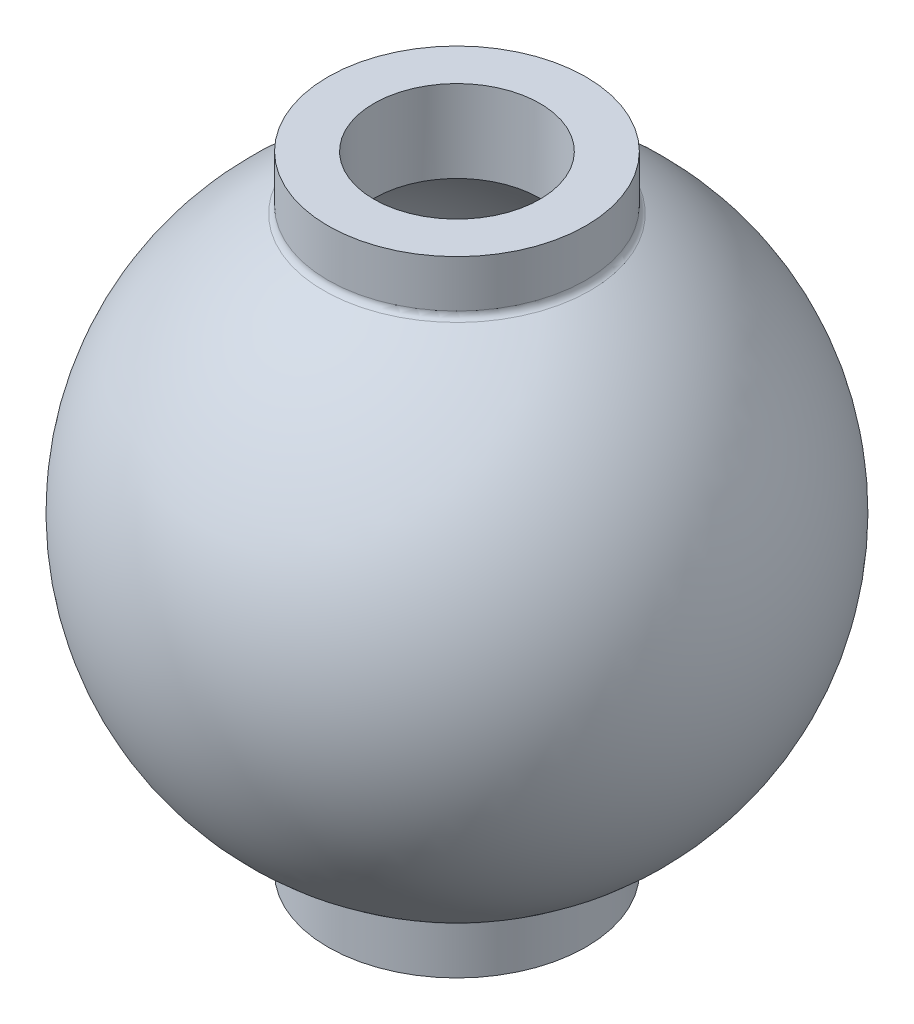
ISO-10303-21;
HEADER;
FILE_DESCRIPTION(('STEP AP214'),'2;1');
FILE_NAME('part.step','',(''),(''),'','','');
FILE_SCHEMA(('AUTOMOTIVE_DESIGN { 1 0 10303 214 1 1 1 1 }'));
ENDSEC;
DATA;
#1=APPLICATION_CONTEXT('core data for automotive mechanical design processes');
#2=APPLICATION_PROTOCOL_DEFINITION('international standard','automotive_design',2000,#1);
#3=PRODUCT_CONTEXT('',#1,'mechanical');
#4=PRODUCT('Part','Part','',(#3));
#5=PRODUCT_RELATED_PRODUCT_CATEGORY('part','',(#4));
#6=PRODUCT_DEFINITION_FORMATION('','',#4);
#7=PRODUCT_DEFINITION_CONTEXT('part definition',#1,'design');
#8=PRODUCT_DEFINITION('design','',#6,#7);
#9=PRODUCT_DEFINITION_SHAPE('','',#8);
#10=(LENGTH_UNIT() NAMED_UNIT(*) SI_UNIT(.MILLI.,.METRE.));
#11=(NAMED_UNIT(*) PLANE_ANGLE_UNIT() SI_UNIT($,.RADIAN.));
#12=(NAMED_UNIT(*) SI_UNIT($,.STERADIAN.) SOLID_ANGLE_UNIT());
#13=UNCERTAINTY_MEASURE_WITH_UNIT(LENGTH_MEASURE(1.E-05),#10,'distance_accuracy_value','');
#14=(GEOMETRIC_REPRESENTATION_CONTEXT(3) GLOBAL_UNCERTAINTY_ASSIGNED_CONTEXT((#13)) GLOBAL_UNIT_ASSIGNED_CONTEXT((#10,
#11,#12)) REPRESENTATION_CONTEXT('',''));
#15=CARTESIAN_POINT('',(0.,0.,0.));
#16=DIRECTION('',(0.,0.,1.));
#17=DIRECTION('',(1.,0.,0.));
#18=AXIS2_PLACEMENT_3D('',#15,#16,#17);
#19=CARTESIAN_POINT('',(0.,0.,0.));
#20=DIRECTION('',(0.,1.,0.));
#21=DIRECTION('',(-1.,0.,0.));
#22=AXIS2_PLACEMENT_3D('',#19,#20,#21);
#23=SPHERICAL_SURFACE('',#22,1120.);
#24=CARTESIAN_POINT('',(0.,-1079.0736768173,0.));
#25=DIRECTION('',(0.,1.,0.));
#26=DIRECTION('',(0.,0.,1.));
#27=AXIS2_PLACEMENT_3D('',#24,#25,#26);
#28=CIRCLE('',#27,300.);
#29=CARTESIAN_POINT('',(-300.,-1079.0736768173,0.));
#30=VERTEX_POINT('',#29);
#31=EDGE_CURVE('E43',#30,#30,#28,.T.);
#32=CARTESIAN_POINT('',(0.,-1073.3126291999,0.));
#33=DIRECTION('',(0.,1.,0.));
#34=DIRECTION('',(0.,0.,1.));
#35=AXIS2_PLACEMENT_3D('',#32,#33,#34);
#36=CIRCLE('',#35,320.);
#37=CARTESIAN_POINT('',(-320.,-1073.3126291999,0.));
#38=VERTEX_POINT('',#37);
#39=EDGE_CURVE('E59',#38,#38,#36,.T.);
#40=CARTESIAN_POINT('',(-300.,-1079.0736768173,0.));
#41=CARTESIAN_POINT('',(-300.208884943799,-1079.01560341186,0.));
#42=CARTESIAN_POINT('',(-300.417753024992,-1078.95746935311,0.));
#43=CARTESIAN_POINT('',(-300.835455391734,-1078.84107994861,0.));
#44=CARTESIAN_POINT('',(-301.044289677282,-1078.78282460287,0.));
#45=CARTESIAN_POINT('',(-301.461924382303,-1078.66619264403,0.));
#46=CARTESIAN_POINT('',(-301.670724801775,-1078.60781603093,0.));
#47=CARTESIAN_POINT('',(-302.088291704225,-1078.49094155707,0.));
#48=CARTESIAN_POINT('',(-302.297058187202,-1078.43244369631,0.));
#49=CARTESIAN_POINT('',(-302.714557146256,-1078.31532674686,0.));
#50=CARTESIAN_POINT('',(-302.923289622332,-1078.25670765816,0.));
#51=CARTESIAN_POINT('',(-303.340720497187,-1078.13934827261,0.));
#52=CARTESIAN_POINT('',(-303.549418895967,-1078.08060797575,0.));
#53=CARTESIAN_POINT('',(-303.966781545845,-1077.96300619367,0.));
#54=CARTESIAN_POINT('',(-304.175445796943,-1077.90414470846,0.));
#55=CARTESIAN_POINT('',(-304.592740081087,-1077.78630056952,0.));
#56=CARTESIAN_POINT('',(-304.801370114132,-1077.7273179158,0.));
#57=CARTESIAN_POINT('',(-305.218595891808,-1077.60923145975,0.));
#58=CARTESIAN_POINT('',(-305.427191636439,-1077.55012765742,0.));
#59=CARTESIAN_POINT('',(-305.844348766938,-1077.43179892407,0.));
#60=CARTESIAN_POINT('',(-306.052910152806,-1077.37257399306,0.));
#61=CARTESIAN_POINT('',(-306.46999849544,-1077.25400302234,0.));
#62=CARTESIAN_POINT('',(-306.678525452206,-1077.19465698262,0.));
#63=CARTESIAN_POINT('',(-307.095544866311,-1077.07584381449,0.));
#64=CARTESIAN_POINT('',(-307.30403732365,-1077.01637668609,0.));
#65=CARTESIAN_POINT('',(-307.720987668586,-1076.89732136063,0.));
#66=CARTESIAN_POINT('',(-307.929445556183,-1076.83773316359,0.));
#67=CARTESIAN_POINT('',(-308.346326691332,-1076.71843572097,0.));
#68=CARTESIAN_POINT('',(-308.554749938885,-1076.65872647538,0.));
#69=CARTESIAN_POINT('',(-308.971561723653,-1076.53918695582,0.));
#70=CARTESIAN_POINT('',(-309.17995026087,-1076.47935668183,0.));
#71=CARTESIAN_POINT('',(-309.596692554687,-1076.35957512564,0.));
#72=CARTESIAN_POINT('',(-309.805046311288,-1076.29962384343,0.));
#73=CARTESIAN_POINT('',(-310.221718973607,-1076.179600291,0.));
#74=CARTESIAN_POINT('',(-310.430037879325,-1076.11952802079,0.));
#75=CARTESIAN_POINT('',(-310.846640769622,-1075.99926251261,0.));
#76=CARTESIAN_POINT('',(-311.054924754201,-1075.93906927465,0.));
#77=CARTESIAN_POINT('',(-311.471457731975,-1075.81856185128,0.));
#78=CARTESIAN_POINT('',(-311.679706725171,-1075.75824766587,0.));
#79=CARTESIAN_POINT('',(-312.096169649946,-1075.63749836795,0.));
#80=CARTESIAN_POINT('',(-312.304383581526,-1075.57706325544,0.));
#81=CARTESIAN_POINT('',(-312.72077631285,-1075.4560721237,0.));
#82=CARTESIAN_POINT('',(-312.928955112593,-1075.39551610446,0.));
#83=CARTESIAN_POINT('',(-313.345277510036,-1075.27428317969,0.));
#84=CARTESIAN_POINT('',(-313.553421107734,-1075.21360627416,0.));
#85=CARTESIAN_POINT('',(-313.96967303089,-1075.09213159725,0.));
#86=CARTESIAN_POINT('',(-314.177781356347,-1075.03133382588,0.));
#87=CARTESIAN_POINT('',(-314.593962664834,-1074.9096174378,0.));
#88=CARTESIAN_POINT('',(-314.802035647864,-1074.8486988211,0.));
#89=CARTESIAN_POINT('',(-315.218146201325,-1074.7267407629,0.));
#90=CARTESIAN_POINT('',(-315.426183771755,-1074.66570132141,0.));
#91=CARTESIAN_POINT('',(-315.842223429855,-1074.54350163422,0.));
#92=CARTESIAN_POINT('',(-316.050225517524,-1074.48234138852,0.));
#93=CARTESIAN_POINT('',(-316.466194139953,-1074.35990011356,0.));
#94=CARTESIAN_POINT('',(-316.674160674713,-1074.29861908429,0.));
#95=CARTESIAN_POINT('',(-317.090058121185,-1074.17593626284,0.));
#96=CARTESIAN_POINT('',(-317.297989032897,-1074.11453447066,0.));
#97=CARTESIAN_POINT('',(-317.713815163149,-1073.9916101441,0.));
#98=CARTESIAN_POINT('',(-317.921710381689,-1073.93008760972,0.));
#99=CARTESIAN_POINT('',(-318.337465055484,-1073.80692181951,0.));
#100=CARTESIAN_POINT('',(-318.545324510738,-1073.74527856368,0.));
#101=CARTESIAN_POINT('',(-318.961007587861,-1073.62187135135,0.));
#102=CARTESIAN_POINT('',(-319.168831209729,-1073.56010739485,0.));
#103=CARTESIAN_POINT('',(-319.584442549991,-1073.43645880204,0.));
#104=CARTESIAN_POINT('',(-319.792230268386,-1073.37457416571,0.));
#105=CARTESIAN_POINT('',(-320.,-1073.3126291999,0.));
#106=B_SPLINE_CURVE_WITH_KNOTS('',3,(#40,#41,#42,#43,#44,#45,#46,#47,#48,#49,#50,#51,#52,#53,
#54,#55,#56,#57,#58,#59,#60,#61,#62,#63,#64,#65,#66,#67,#68,#69,#70,#71,#72,#73,#74,#75,#76,#77,
#78,#79,#80,#81,#82,#83,#84,#85,#86,#87,#88,#89,#90,#91,#92,#93,#94,#95,#96,#97,#98,#99,#100,
#101,#102,#103,#104,#105),.UNSPECIFIED.,.F.,.F.,(4,2,2,2,2,2,2,2,2,2,2,2,2,2,2,2,2,2,2,2,2,2,2,
2,2,2,2,2,2,2,2,2,4),(0.,0.650422131847007,1.30084426369426,1.95126639554164,2.60168852738862,
3.25211065923567,3.902532791083,4.55295492293026,5.20337705477728,5.85379918662442,
6.50422131847172,7.15464345031896,7.80506558216603,8.45548771401308,9.10590984586034,
9.75633197770773,10.4067541095547,11.0571762414018,11.7075983732491,12.3580205050964,
13.0084426369434,13.6588647687905,14.3092869006377,14.9597090324851,15.6101311643321,
16.2605532961791,16.9109754280264,17.5613975598738,18.2118196917207,18.8622418235679,
19.5126639554151,20.1630860872624,20.8135082191095),.UNSPECIFIED.);
#107=EDGE_CURVE('BSEAM39',#30,#38,#106,.T.);
#108=ORIENTED_EDGE('',*,*,#31,.T.);
#109=ORIENTED_EDGE('',*,*,#39,.F.);
#110=ORIENTED_EDGE('',*,*,#107,.T.);
#111=ORIENTED_EDGE('',*,*,#107,.F.);
#112=EDGE_LOOP('',(#108,#110,#109,#111));
#113=FACE_BOUND('',#112,.T.);
#114=ADVANCED_FACE('F39',(#113),#23,.T.);
#115=CARTESIAN_POINT('',(0.,1478.86317940526,0.));
#116=DIRECTION('',(0.,1.,0.));
#117=DIRECTION('',(0.,0.,1.));
#118=AXIS2_PLACEMENT_3D('',#115,#116,#117);
#119=CYLINDRICAL_SURFACE('',#118,320.);
#120=ORIENTED_EDGE('',*,*,#39,.T.);
#121=EDGE_LOOP('',(#120));
#122=FACE_BOUND('',#121,.T.);
#123=CARTESIAN_POINT('',(0.,-1203.63917320918,0.));
#124=DIRECTION('',(0.,1.,0.));
#125=DIRECTION('',(0.,0.,1.));
#126=AXIS2_PLACEMENT_3D('',#123,#124,#125);
#127=CIRCLE('',#126,320.);
#128=CARTESIAN_POINT('',(0.,-1203.63917320918,320.));
#129=VERTEX_POINT('',#128);
#130=EDGE_CURVE('E66',#129,#129,#127,.T.);
#131=ORIENTED_EDGE('',*,*,#130,.F.);
#132=EDGE_LOOP('',(#131));
#133=FACE_BOUND('',#132,.T.);
#134=ADVANCED_FACE('F100',(#122,#133),#119,.F.);
#135=CARTESIAN_POINT('',(0.,-1203.63917320918,0.));
#136=DIRECTION('',(0.,1.,0.));
#137=DIRECTION('',(0.,0.,1.));
#138=AXIS2_PLACEMENT_3D('',#135,#136,#137);
#139=PLANE('',#138);
#140=CARTESIAN_POINT('',(0.,-1203.63917320918,0.));
#141=DIRECTION('',(0.,1.,0.));
#142=DIRECTION('',(0.,0.,1.));
#143=AXIS2_PLACEMENT_3D('',#140,#141,#142);
#144=CIRCLE('',#143,497.1);
#145=CARTESIAN_POINT('',(0.,-1203.63917320918,497.1));
#146=VERTEX_POINT('',#145);
#147=EDGE_CURVE('E69',#146,#146,#144,.T.);
#148=ORIENTED_EDGE('',*,*,#147,.F.);
#149=EDGE_LOOP('',(#148));
#150=FACE_BOUND('',#149,.T.);
#151=ORIENTED_EDGE('',*,*,#130,.T.);
#152=EDGE_LOOP('',(#151));
#153=FACE_BOUND('',#152,.T.);
#154=ADVANCED_FACE('F105',(#150,#153),#139,.F.);
#155=CARTESIAN_POINT('',(0.,1478.86317940526,0.));
#156=DIRECTION('',(0.,1.,0.));
#157=DIRECTION('',(0.,0.,1.));
#158=AXIS2_PLACEMENT_3D('',#155,#156,#157);
#159=CYLINDRICAL_SURFACE('',#158,497.1);
#160=CARTESIAN_POINT('',(0.,-1022.08883664777,0.));
#161=DIRECTION('',(0.,1.,0.));
#162=DIRECTION('',(0.,0.,1.));
#163=AXIS2_PLACEMENT_3D('',#160,#161,#162);
#164=CIRCLE('',#163,497.1);
#165=CARTESIAN_POINT('',(0.,-1022.08883664777,497.1));
#166=VERTEX_POINT('',#165);
#167=EDGE_CURVE('E47',#166,#166,#164,.F.);
#168=ORIENTED_EDGE('',*,*,#167,.T.);
#169=EDGE_LOOP('',(#168));
#170=FACE_BOUND('',#169,.T.);
#171=ORIENTED_EDGE('',*,*,#147,.T.);
#172=EDGE_LOOP('',(#171));
#173=FACE_BOUND('',#172,.T.);
#174=ADVANCED_FACE('F125',(#170,#173),#159,.T.);
#175=CARTESIAN_POINT('',(0.,0.,0.));
#176=DIRECTION('',(0.,1.,0.));
#177=DIRECTION('',(1.,0.,0.));
#178=AXIS2_PLACEMENT_3D('',#175,#176,#177);
#179=SPHERICAL_SURFACE('',#178,1120.);
#180=CARTESIAN_POINT('',(0.,-995.425649604789,0.));
#181=DIRECTION('',(0.,1.,0.));
#182=DIRECTION('',(0.,0.,1.));
#183=AXIS2_PLACEMENT_3D('',#180,#181,#182);
#184=CIRCLE('',#183,513.349565217392);
#185=CARTESIAN_POINT('',(513.349565217391,-995.425649604789,0.));
#186=VERTEX_POINT('',#185);
#187=EDGE_CURVE('E51',#186,#186,#184,.T.);
#188=CARTESIAN_POINT('',(0.,995.425649604789,0.));
#189=DIRECTION('',(0.,-1.,0.));
#190=DIRECTION('',(0.,0.,-1.));
#191=AXIS2_PLACEMENT_3D('',#188,#189,#190);
#192=CIRCLE('',#191,513.349565217392);
#193=CARTESIAN_POINT('',(513.349565217391,995.425649604789,0.));
#194=VERTEX_POINT('',#193);
#195=EDGE_CURVE('E56',#194,#194,#192,.T.);
#196=CARTESIAN_POINT('',(513.349565217391,-995.425649604789,0.));
#197=CARTESIAN_POINT('',(519.024847080551,-992.498864411584,0.));
#198=CARTESIAN_POINT('',(524.675093604837,-989.523534075268,0.));
#199=CARTESIAN_POINT('',(535.923874970314,-983.476675721307,0.));
#200=CARTESIAN_POINT('',(541.522409811505,-980.405147703662,0.));
#201=CARTESIAN_POINT('',(552.666126805445,-974.166786591942,0.));
#202=CARTESIAN_POINT('',(558.211308958194,-970.999953497865,0.));
#203=CARTESIAN_POINT('',(569.246699231323,-964.571910259543,0.));
#204=CARTESIAN_POINT('',(574.736907351702,-961.310700115298,0.));
#205=CARTESIAN_POINT('',(585.66074321226,-954.694856391687,0.));
#206=CARTESIAN_POINT('',(591.094370952439,-951.340222812321,0.));
#207=CARTESIAN_POINT('',(601.903456547955,-944.538513705218,0.));
#208=CARTESIAN_POINT('',(607.278914403291,-941.091438177481,0.));
#209=CARTESIAN_POINT('',(617.970087663649,-934.105853558503,0.));
#210=CARTESIAN_POINT('',(623.28580306867,-930.567344467262,0.));
#211=CARTESIAN_POINT('',(633.855936361019,-923.399927893202,0.));
#212=CARTESIAN_POINT('',(639.110354248346,-919.771020410382,0.));
#213=CARTESIAN_POINT('',(649.556355364445,-912.423868660032,0.));
#214=CARTESIAN_POINT('',(654.747938593217,-908.705624392501,0.));
#215=CARTESIAN_POINT('',(665.066751634645,-901.180886817176,0.));
#216=CARTESIAN_POINT('',(670.1939814473,-897.374393509383,0.));
#217=CARTESIAN_POINT('',(680.382587724629,-889.674271413815,0.));
#218=CARTESIAN_POINT('',(685.443964189302,-885.780642626041,0.));
#219=CARTESIAN_POINT('',(695.4993831038,-877.907388621811,0.));
#220=CARTESIAN_POINT('',(700.493425553625,-873.927763405355,0.));
#221=CARTESIAN_POINT('',(710.412715469584,-865.883680752602,0.));
#222=CARTESIAN_POINT('',(715.337962935717,-861.819223316306,0.));
#223=CARTESIAN_POINT('',(725.118222040898,-853.606665249743,0.));
#224=CARTESIAN_POINT('',(729.973233679947,-849.458564619477,0.));
#225=CARTESIAN_POINT('',(739.61160083452,-841.079933660018,0.));
#226=CARTESIAN_POINT('',(744.394956350044,-836.849403330825,0.));
#227=CARTESIAN_POINT('',(753.888611923576,-828.307150582732,0.));
#228=CARTESIAN_POINT('',(758.598911981584,-823.995428163832,0.));
#229=CARTESIAN_POINT('',(767.945078677908,-815.29205259767,0.));
#230=CARTESIAN_POINT('',(772.580945316224,-810.900399450407,0.));
#231=CARTESIAN_POINT('',(781.776888985914,-802.038447171984,0.));
#232=CARTESIAN_POINT('',(786.336966017287,-797.568148040823,0.));
#233=CARTESIAN_POINT('',(795.37999645751,-788.550211546349,0.));
#234=CARTESIAN_POINT('',(799.862949866359,-784.002574183036,0.));
#235=CARTESIAN_POINT('',(808.750421607876,-774.83129160071,0.));
#236=CARTESIAN_POINT('',(813.154939940543,-770.207646381696,0.));
#237=CARTESIAN_POINT('',(821.884253021621,-760.885700699936,0.));
#238=CARTESIAN_POINT('',(826.209047770031,-756.18740023719,0.));
#239=CARTESIAN_POINT('',(834.777648497039,-746.717518519751,0.));
#240=CARTESIAN_POINT('',(839.021454475637,-741.945937265059,0.));
#241=CARTESIAN_POINT('',(847.426836170112,-732.330889853251,0.));
#242=CARTESIAN_POINT('',(851.58841188599,-727.487423696134,0.));
#243=CARTESIAN_POINT('',(859.828115617947,-717.730023398374,0.));
#244=CARTESIAN_POINT('',(863.906243634027,-712.816089257731,0.));
#245=CARTESIAN_POINT('',(871.977858941298,-702.919190526685,0.));
#246=CARTESIAN_POINT('',(875.971346232489,-697.936225936282,0.));
#247=CARTESIAN_POINT('',(883.872511825886,-687.902724033812,0.));
#248=CARTESIAN_POINT('',(887.780190128092,-682.852186721745,0.));
#249=CARTESIAN_POINT('',(895.508594582185,-672.685016871924,0.));
#250=CARTESIAN_POINT('',(899.329320734072,-667.56838433417,0.));
#251=CARTESIAN_POINT('',(906.882703163377,-657.270520864604,0.));
#252=CARTESIAN_POINT('',(910.615359440795,-652.089289932792,0.));
#253=CARTESIAN_POINT('',(917.99151016118,-641.663745404504,0.));
#254=CARTESIAN_POINT('',(921.635004604148,-636.419431808028,0.));
#255=CARTESIAN_POINT('',(928.83176577926,-625.869256134157,0.));
#256=CARTESIAN_POINT('',(932.385032511405,-620.563394056761,0.));
#257=CARTESIAN_POINT('',(939.400298783927,-609.89167361033,0.));
#258=CARTESIAN_POINT('',(942.862298324303,-604.525815241295,0.));
#259=CARTESIAN_POINT('',(949.69401743186,-593.735671952321,0.));
#260=CARTESIAN_POINT('',(953.06373699904,-588.311387032382,0.));
#261=CARTESIAN_POINT('',(959.709910374573,-577.405977474575,0.));
#262=CARTESIAN_POINT('',(962.986364182926,-571.924852836707,0.));
#263=CARTESIAN_POINT('',(969.445047539359,-560.907367304041,0.));
#264=CARTESIAN_POINT('',(972.627277087438,-555.371006409244,0.));
#265=CARTESIAN_POINT('',(978.896580986461,-544.244667982661,0.));
#266=CARTESIAN_POINT('',(981.983655337405,-538.654690450876,0.));
#267=CARTESIAN_POINT('',(988.061745742218,-527.422754055398,0.));
#268=CARTESIAN_POINT('',(991.052761796088,-521.780795191704,0.));
#269=CARTESIAN_POINT('',(996.937860607933,-510.446546644228,0.));
#270=CARTESIAN_POINT('',(999.831943365909,-504.754256960445,0.));
#271=CARTESIAN_POINT('',(1005.52232894424,-493.321012008504,0.));
#272=CARTESIAN_POINT('',(1008.31863176459,-487.580056740346,0.));
#273=CARTESIAN_POINT('',(1013.81263943073,-476.051160092113,0.));
#274=CARTESIAN_POINT('',(1016.5103442765,-470.263218712038,0.));
#275=CARTESIAN_POINT('',(1021.80636680061,-458.642043057857,0.));
#276=CARTESIAN_POINT('',(1024.40468447893,-452.80880878375,0.));
#277=CARTESIAN_POINT('',(1029.50117255021,-441.098753809479,0.));
#278=CARTESIAN_POINT('',(1031.99934294317,-435.221933109315,0.));
#279=CARTESIAN_POINT('',(1036.89480562311,-423.426424501778,0.));
#280=CARTESIAN_POINT('',(1039.29209791009,-417.507736594405,0.));
#281=CARTESIAN_POINT('',(1043.9851030686,-405.63022503923,0.));
#282=CARTESIAN_POINT('',(1046.28081594013,-399.671401391428,0.));
#283=CARTESIAN_POINT('',(1050.76999067454,-387.715361563577,0.));
#284=CARTESIAN_POINT('',(1052.96345253741,-381.718145383528,0.));
#285=CARTESIAN_POINT('',(1057.24748357404,-369.687074930808,0.));
#286=CARTESIAN_POINT('',(1059.3380527478,-363.653220658137,0.));
#287=CARTESIAN_POINT('',(1063.41568682622,-351.550639177987,0.));
#288=CARTESIAN_POINT('',(1065.40275173088,-345.48191197051,0.));
#289=CARTESIAN_POINT('',(1069.2727959705,-333.311359980375,0.));
#290=CARTESIAN_POINT('',(1071.15577530546,-327.209535197718,0.));
#291=CARTESIAN_POINT('',(1074.81709755449,-314.974573099294,0.));
#292=CARTESIAN_POINT('',(1076.59544046857,-308.841435783526,0.));
#293=CARTESIAN_POINT('',(1080.04696963526,-296.54564282119,0.));
#294=CARTESIAN_POINT('',(1081.72015588787,-290.382987174622,0.));
#295=CARTESIAN_POINT('',(1084.96088225382,-278.029960388356,0.));
#296=CARTESIAN_POINT('',(1086.52842236716,-271.839589248659,0.));
#297=CARTESIAN_POINT('',(1089.5573978827,-259.432942421761,0.));
#298=CARTESIAN_POINT('',(1091.01883328492,-253.216666734561,0.));
#299=CARTESIAN_POINT('',(1093.83517184649,-240.760029336462,0.));
#300=CARTESIAN_POINT('',(1095.19007500586,-234.519667625562,0.));
#301=CARTESIAN_POINT('',(1097.79295271521,-222.01668375005,0.));
#302=CARTESIAN_POINT('',(1099.04092726519,-215.754061585436,0.));
#303=CARTESIAN_POINT('',(1101.42958267039,-203.208388884605,0.));
#304=CARTESIAN_POINT('',(1102.5702635256,-196.925338348388,0.));
#305=CARTESIAN_POINT('',(1104.74399784382,-184.340646962623,0.));
#306=CARTESIAN_POINT('',(1105.77705130682,-178.039006113075,0.));
#307=CARTESIAN_POINT('',(1107.73522862875,-165.418977597376,0.));
#308=CARTESIAN_POINT('',(1108.66035248767,-159.100589931225,0.));
#309=CARTESIAN_POINT('',(1110.40239996353,-146.448916178199,0.));
#310=CARTESIAN_POINT('',(1111.21932358048,-140.115630091325,0.));
#311=CARTESIAN_POINT('',(1112.74473158765,-127.436012251153,0.));
#312=CARTESIAN_POINT('',(1113.45321597787,-121.089680497855,0.));
#313=CARTESIAN_POINT('',(1114.76153826993,-108.385827895543,0.));
#314=CARTESIAN_POINT('',(1115.36137617176,-102.02830704653,0.));
#315=CARTESIAN_POINT('',(1116.45223000904,-89.30393609678,0.));
#316=CARTESIAN_POINT('',(1116.9432459445,-82.9370859960437,0.));
#317=CARTESIAN_POINT('',(1117.81631220608,-70.1959191160425,0.));
#318=CARTESIAN_POINT('',(1118.19836253221,-63.8216023367775,0.));
#319=CARTESIAN_POINT('',(1118.85338580924,-51.0673668572322,0.));
#320=CARTESIAN_POINT('',(1119.12635876015,-44.6874481569519,0.));
#321=CARTESIAN_POINT('',(1119.56314743061,-31.9238752316886,0.));
#322=CARTESIAN_POINT('',(1119.72696315016,-25.5402210067056,0.));
#323=CARTESIAN_POINT('',(1119.94538943485,-12.7710445211483,0.));
#324=CARTESIAN_POINT('',(1120.,-6.38552226057418,0.));
#325=CARTESIAN_POINT('',(1120.,6.38552226057418,0.));
#326=CARTESIAN_POINT('',(1119.94538943485,12.7710445211483,0.));
#327=CARTESIAN_POINT('',(1119.72696315016,25.5402210067056,0.));
#328=CARTESIAN_POINT('',(1119.56314743061,31.9238752316886,0.));
#329=CARTESIAN_POINT('',(1119.12635876015,44.687448156952,0.));
#330=CARTESIAN_POINT('',(1118.85338580924,51.0673668572322,0.));
#331=CARTESIAN_POINT('',(1118.19836253221,63.8216023367775,0.));
#332=CARTESIAN_POINT('',(1117.81631220608,70.1959191160425,0.));
#333=CARTESIAN_POINT('',(1116.9432459445,82.9370859960437,0.));
#334=CARTESIAN_POINT('',(1116.45223000904,89.30393609678,0.));
#335=CARTESIAN_POINT('',(1115.36137617176,102.02830704653,0.));
#336=CARTESIAN_POINT('',(1114.76153826993,108.385827895543,0.));
#337=CARTESIAN_POINT('',(1113.45321597787,121.089680497855,0.));
#338=CARTESIAN_POINT('',(1112.74473158765,127.436012251153,0.));
#339=CARTESIAN_POINT('',(1111.21932358048,140.115630091326,0.));
#340=CARTESIAN_POINT('',(1110.40239996353,146.4489161782,0.));
#341=CARTESIAN_POINT('',(1108.66035248767,159.100589931225,0.));
#342=CARTESIAN_POINT('',(1107.73522862875,165.418977597376,0.));
#343=CARTESIAN_POINT('',(1105.77705130682,178.039006113074,0.));
#344=CARTESIAN_POINT('',(1104.74399784382,184.340646962622,0.));
#345=CARTESIAN_POINT('',(1102.5702635256,196.925338348388,0.));
#346=CARTESIAN_POINT('',(1101.42958267039,203.208388884605,0.));
#347=CARTESIAN_POINT('',(1099.04092726519,215.754061585436,0.));
#348=CARTESIAN_POINT('',(1097.79295271521,222.01668375005,0.));
#349=CARTESIAN_POINT('',(1095.19007500586,234.519667625562,0.));
#350=CARTESIAN_POINT('',(1093.83517184649,240.760029336462,0.));
#351=CARTESIAN_POINT('',(1091.01883328492,253.216666734561,0.));
#352=CARTESIAN_POINT('',(1089.5573978827,259.432942421761,0.));
#353=CARTESIAN_POINT('',(1086.52842236716,271.839589248659,0.));
#354=CARTESIAN_POINT('',(1084.96088225382,278.029960388356,0.));
#355=CARTESIAN_POINT('',(1081.72015588787,290.382987174622,0.));
#356=CARTESIAN_POINT('',(1080.04696963526,296.54564282119,0.));
#357=CARTESIAN_POINT('',(1076.59544046857,308.841435783526,0.));
#358=CARTESIAN_POINT('',(1074.81709755449,314.974573099294,0.));
#359=CARTESIAN_POINT('',(1071.15577530546,327.209535197718,0.));
#360=CARTESIAN_POINT('',(1069.2727959705,333.311359980375,0.));
#361=CARTESIAN_POINT('',(1065.40275173088,345.48191197051,0.));
#362=CARTESIAN_POINT('',(1063.41568682622,351.550639177987,0.));
#363=CARTESIAN_POINT('',(1059.3380527478,363.653220658137,0.));
#364=CARTESIAN_POINT('',(1057.24748357404,369.687074930808,0.));
#365=CARTESIAN_POINT('',(1052.96345253741,381.718145383528,0.));
#366=CARTESIAN_POINT('',(1050.76999067454,387.715361563577,0.));
#367=CARTESIAN_POINT('',(1046.28081594013,399.671401391428,0.));
#368=CARTESIAN_POINT('',(1043.9851030686,405.63022503923,0.));
#369=CARTESIAN_POINT('',(1039.29209791009,417.507736594405,0.));
#370=CARTESIAN_POINT('',(1036.89480562311,423.426424501778,0.));
#371=CARTESIAN_POINT('',(1031.99934294317,435.221933109315,0.));
#372=CARTESIAN_POINT('',(1029.50117255021,441.098753809479,0.));
#373=CARTESIAN_POINT('',(1024.40468447893,452.80880878375,0.));
#374=CARTESIAN_POINT('',(1021.80636680061,458.642043057857,0.));
#375=CARTESIAN_POINT('',(1016.5103442765,470.263218712038,0.));
#376=CARTESIAN_POINT('',(1013.81263943073,476.051160092113,0.));
#377=CARTESIAN_POINT('',(1008.31863176459,487.580056740346,0.));
#378=CARTESIAN_POINT('',(1005.52232894424,493.321012008504,0.));
#379=CARTESIAN_POINT('',(999.831943365909,504.754256960445,0.));
#380=CARTESIAN_POINT('',(996.937860607933,510.446546644228,0.));
#381=CARTESIAN_POINT('',(991.052761796088,521.780795191704,0.));
#382=CARTESIAN_POINT('',(988.061745742218,527.422754055398,0.));
#383=CARTESIAN_POINT('',(981.983655337405,538.654690450876,0.));
#384=CARTESIAN_POINT('',(978.896580986461,544.244667982661,0.));
#385=CARTESIAN_POINT('',(972.627277087438,555.371006409244,0.));
#386=CARTESIAN_POINT('',(969.445047539359,560.907367304041,0.));
#387=CARTESIAN_POINT('',(962.986364182926,571.924852836707,0.));
#388=CARTESIAN_POINT('',(959.709910374573,577.405977474575,0.));
#389=CARTESIAN_POINT('',(953.06373699904,588.311387032382,0.));
#390=CARTESIAN_POINT('',(949.69401743186,593.735671952321,0.));
#391=CARTESIAN_POINT('',(942.862298324303,604.525815241295,0.));
#392=CARTESIAN_POINT('',(939.400298783927,609.89167361033,0.));
#393=CARTESIAN_POINT('',(932.385032511405,620.563394056761,0.));
#394=CARTESIAN_POINT('',(928.83176577926,625.869256134157,0.));
#395=CARTESIAN_POINT('',(921.635004604148,636.419431808028,0.));
#396=CARTESIAN_POINT('',(917.99151016118,641.663745404504,0.));
#397=CARTESIAN_POINT('',(910.615359440795,652.089289932792,0.));
#398=CARTESIAN_POINT('',(906.882703163377,657.270520864604,0.));
#399=CARTESIAN_POINT('',(899.329320734072,667.56838433417,0.));
#400=CARTESIAN_POINT('',(895.508594582185,672.685016871924,0.));
#401=CARTESIAN_POINT('',(887.780190128092,682.852186721745,0.));
#402=CARTESIAN_POINT('',(883.872511825886,687.902724033812,0.));
#403=CARTESIAN_POINT('',(875.971346232489,697.936225936282,0.));
#404=CARTESIAN_POINT('',(871.977858941298,702.919190526685,0.));
#405=CARTESIAN_POINT('',(863.906243634027,712.816089257731,0.));
#406=CARTESIAN_POINT('',(859.828115617947,717.730023398374,0.));
#407=CARTESIAN_POINT('',(851.58841188599,727.487423696134,0.));
#408=CARTESIAN_POINT('',(847.426836170112,732.330889853251,0.));
#409=CARTESIAN_POINT('',(839.021454475637,741.945937265059,0.));
#410=CARTESIAN_POINT('',(834.777648497039,746.717518519751,0.));
#411=CARTESIAN_POINT('',(826.209047770031,756.18740023719,0.));
#412=CARTESIAN_POINT('',(821.884253021621,760.885700699936,0.));
#413=CARTESIAN_POINT('',(813.154939940543,770.207646381696,0.));
#414=CARTESIAN_POINT('',(808.750421607876,774.83129160071,0.));
#415=CARTESIAN_POINT('',(799.862949866359,784.002574183036,0.));
#416=CARTESIAN_POINT('',(795.37999645751,788.550211546349,0.));
#417=CARTESIAN_POINT('',(786.336966017287,797.568148040823,0.));
#418=CARTESIAN_POINT('',(781.776888985914,802.038447171984,0.));
#419=CARTESIAN_POINT('',(772.580945316224,810.900399450407,0.));
#420=CARTESIAN_POINT('',(767.945078677908,815.29205259767,0.));
#421=CARTESIAN_POINT('',(758.598911981584,823.995428163832,0.));
#422=CARTESIAN_POINT('',(753.888611923576,828.307150582732,0.));
#423=CARTESIAN_POINT('',(744.394956350044,836.849403330825,0.));
#424=CARTESIAN_POINT('',(739.61160083452,841.079933660018,0.));
#425=CARTESIAN_POINT('',(729.973233679947,849.458564619477,0.));
#426=CARTESIAN_POINT('',(725.118222040898,853.606665249743,0.));
#427=CARTESIAN_POINT('',(715.337962935717,861.819223316306,0.));
#428=CARTESIAN_POINT('',(710.412715469584,865.883680752602,0.));
#429=CARTESIAN_POINT('',(700.493425553626,873.927763405355,0.));
#430=CARTESIAN_POINT('',(695.4993831038,877.907388621811,0.));
#431=CARTESIAN_POINT('',(685.443964189302,885.780642626041,0.));
#432=CARTESIAN_POINT('',(680.382587724629,889.674271413815,0.));
#433=CARTESIAN_POINT('',(670.1939814473,897.374393509383,0.));
#434=CARTESIAN_POINT('',(665.066751634645,901.180886817176,0.));
#435=CARTESIAN_POINT('',(654.747938593217,908.7056243925,0.));
#436=CARTESIAN_POINT('',(649.556355364445,912.423868660032,0.));
#437=CARTESIAN_POINT('',(639.110354248346,919.771020410382,0.));
#438=CARTESIAN_POINT('',(633.855936361019,923.399927893202,0.));
#439=CARTESIAN_POINT('',(623.28580306867,930.567344467262,0.));
#440=CARTESIAN_POINT('',(617.970087663649,934.105853558503,0.));
#441=CARTESIAN_POINT('',(607.278914403291,941.091438177481,0.));
#442=CARTESIAN_POINT('',(601.903456547955,944.538513705218,0.));
#443=CARTESIAN_POINT('',(591.094370952439,951.340222812321,0.));
#444=CARTESIAN_POINT('',(585.66074321226,954.694856391687,0.));
#445=CARTESIAN_POINT('',(574.736907351702,961.310700115298,0.));
#446=CARTESIAN_POINT('',(569.246699231323,964.571910259543,0.));
#447=CARTESIAN_POINT('',(558.211308958194,970.999953497865,0.));
#448=CARTESIAN_POINT('',(552.666126805445,974.166786591942,0.));
#449=CARTESIAN_POINT('',(541.522409811505,980.405147703662,0.));
#450=CARTESIAN_POINT('',(535.923874970314,983.476675721307,0.));
#451=CARTESIAN_POINT('',(524.675093604837,989.523534075268,0.));
#452=CARTESIAN_POINT('',(519.024847080551,992.498864411584,0.));
#453=CARTESIAN_POINT('',(513.349565217391,995.425649604789,0.));
#454=B_SPLINE_CURVE_WITH_KNOTS('',3,(#196,#197,#198,#199,#200,#201,#202,#203,#204,#205,#206,
#207,#208,#209,#210,#211,#212,#213,#214,#215,#216,#217,#218,#219,#220,#221,#222,#223,#224,#225,
#226,#227,#228,#229,#230,#231,#232,#233,#234,#235,#236,#237,#238,#239,#240,#241,#242,#243,#244,
#245,#246,#247,#248,#249,#250,#251,#252,#253,#254,#255,#256,#257,#258,#259,#260,#261,#262,#263,
#264,#265,#266,#267,#268,#269,#270,#271,#272,#273,#274,#275,#276,#277,#278,#279,#280,#281,#282,
#283,#284,#285,#286,#287,#288,#289,#290,#291,#292,#293,#294,#295,#296,#297,#298,#299,#300,#301,
#302,#303,#304,#305,#306,#307,#308,#309,#310,#311,#312,#313,#314,#315,#316,#317,#318,#319,#320,
#321,#322,#323,#324,#325,#326,#327,#328,#329,#330,#331,#332,#333,#334,#335,#336,#337,#338,#339,
#340,#341,#342,#343,#344,#345,#346,#347,#348,#349,#350,#351,#352,#353,#354,#355,#356,#357,#358,
#359,#360,#361,#362,#363,#364,#365,#366,#367,#368,#369,#370,#371,#372,#373,#374,#375,#376,#377,
#378,#379,#380,#381,#382,#383,#384,#385,#386,#387,#388,#389,#390,#391,#392,#393,#394,#395,#396,
#397,#398,#399,#400,#401,#402,#403,#404,#405,#406,#407,#408,#409,#410,#411,#412,#413,#414,#415,
#416,#417,#418,#419,#420,#421,#422,#423,#424,#425,#426,#427,#428,#429,#430,#431,#432,#433,#434,
#435,#436,#437,#438,#439,#440,#441,#442,#443,#444,#445,#446,#447,#448,#449,#450,#451,#452,#453),
.UNSPECIFIED.,.F.,.F.,(4,2,2,2,2,2,2,2,2,2,2,2,2,2,2,2,2,2,2,2,2,2,2,2,2,2,2,2,2,2,2,2,2,2,2,2,
2,2,2,2,2,2,2,2,2,2,2,2,2,2,2,2,2,2,2,2,2,2,2,2,2,2,2,2,2,2,2,2,2,2,2,2,2,2,2,2,2,2,2,2,2,2,2,2,
2,2,2,2,2,2,2,2,2,2,2,2,2,2,2,2,2,2,2,2,2,2,2,2,2,2,2,2,2,2,2,2,2,2,2,2,2,2,2,2,2,2,2,2,4),(0.,
19.1563332815434,38.3126665630869,57.4689998446304,76.6253331261739,95.7816664077173,
114.937999689261,134.094332970804,153.250666252348,172.406999533891,191.563332815435,
210.719666096978,229.875999378521,249.032332660065,268.188665941608,287.344999223152,
306.501332504695,325.657665786239,344.813999067782,363.970332349326,383.126665630869,
402.282998912413,421.439332193956,440.595665475499,459.751998757043,478.908332038587,
498.06466532013,517.220998601673,536.377331883217,555.53366516476,574.689998446304,
593.846331727847,613.002665009391,632.158998290934,651.315331572478,670.471664854021,
689.627998135565,708.784331417108,727.940664698652,747.096997980195,766.253331261739,
785.409664543282,804.565997824826,823.722331106369,842.878664387912,862.034997669456,
881.191330950999,900.347664232543,919.503997514086,938.66033079563,957.816664077173,
976.972997358717,996.12933064026,1015.2856639218,1034.44199720335,1053.59833048489,
1072.75466376643,1091.91099704798,1111.06733032952,1130.22366361106,1149.37999689261,
1168.53633017415,1187.69266345569,1206.84899673724,1226.00533001878,1245.16166330032,
1264.31799658187,1283.47432986341,1302.63066314495,1321.7869964265,1340.94332970804,
1360.09966298959,1379.25599627113,1398.41232955267,1417.56866283422,1436.72499611576,
1455.8813293973,1475.03766267885,1494.19399596039,1513.35032924193,1532.50666252348,
1551.66299580502,1570.81932908656,1589.97566236811,1609.13199564965,1628.28832893119,
1647.44466221274,1666.60099549428,1685.75732877582,1704.91366205737,1724.06999533891,
1743.22632862045,1762.382661902,1781.53899518354,1800.69532846508,1819.85166174663,
1839.00799502817,1858.16432830971,1877.32066159126,1896.4769948728,1915.63332815434,
1934.78966143589,1953.94599471743,1973.10232799898,1992.25866128052,2011.41499456206,
2030.57132784361,2049.72766112515,2068.88399440669,2088.04032768824,2107.19666096978,
2126.35299425132,2145.50932753287,2164.66566081441,2183.82199409595,2202.9783273775,
2222.13466065904,2241.29099394058,2260.44732722213,2279.60366050367,2298.75999378521,
2317.91632706676,2337.0726603483,2356.22899362984,2375.38532691139,2394.54166019293,
2413.69799347447,2432.85432675602,2452.01066003756),.UNSPECIFIED.);
#455=EDGE_CURVE('BSEAM121',#186,#194,#454,.T.);
#456=ORIENTED_EDGE('',*,*,#187,.T.);
#457=ORIENTED_EDGE('',*,*,#195,.T.);
#458=ORIENTED_EDGE('',*,*,#455,.T.);
#459=ORIENTED_EDGE('',*,*,#455,.F.);
#460=EDGE_LOOP('',(#456,#458,#457,#459));
#461=FACE_BOUND('',#460,.T.);
#462=ADVANCED_FACE('F121',(#461),#179,.T.);
#463=CARTESIAN_POINT('',(0.,1478.86317940526,0.));
#464=DIRECTION('',(0.,1.,0.));
#465=DIRECTION('',(0.,0.,1.));
#466=AXIS2_PLACEMENT_3D('',#463,#464,#465);
#467=CYLINDRICAL_SURFACE('',#466,497.1);
#468=CARTESIAN_POINT('',(0.,1022.08883664777,0.));
#469=DIRECTION('',(0.,-1.,0.));
#470=DIRECTION('',(0.,0.,-1.));
#471=AXIS2_PLACEMENT_3D('',#468,#469,#470);
#472=CIRCLE('',#471,497.1);
#473=CARTESIAN_POINT('',(0.,1022.08883664777,-497.1));
#474=VERTEX_POINT('',#473);
#475=EDGE_CURVE('E10',#474,#474,#472,.F.);
#476=ORIENTED_EDGE('',*,*,#475,.T.);
#477=EDGE_LOOP('',(#476));
#478=FACE_BOUND('',#477,.T.);
#479=CARTESIAN_POINT('',(0.,1203.63917320918,0.));
#480=DIRECTION('',(0.,1.,0.));
#481=DIRECTION('',(0.,0.,1.));
#482=AXIS2_PLACEMENT_3D('',#479,#480,#481);
#483=CIRCLE('',#482,497.1);
#484=CARTESIAN_POINT('',(0.,1203.63917320918,497.1));
#485=VERTEX_POINT('',#484);
#486=EDGE_CURVE('E72',#485,#485,#483,.T.);
#487=ORIENTED_EDGE('',*,*,#486,.F.);
#488=EDGE_LOOP('',(#487));
#489=FACE_BOUND('',#488,.T.);
#490=ADVANCED_FACE('F124',(#478,#489),#467,.T.);
#491=CARTESIAN_POINT('',(0.,1203.63917320918,0.));
#492=DIRECTION('',(0.,1.,0.));
#493=DIRECTION('',(0.,0.,1.));
#494=AXIS2_PLACEMENT_3D('',#491,#492,#493);
#495=PLANE('',#494);
#496=ORIENTED_EDGE('',*,*,#486,.T.);
#497=EDGE_LOOP('',(#496));
#498=FACE_BOUND('',#497,.T.);
#499=CARTESIAN_POINT('',(0.,1203.63917320918,0.));
#500=DIRECTION('',(0.,1.,0.));
#501=DIRECTION('',(0.,0.,1.));
#502=AXIS2_PLACEMENT_3D('',#499,#500,#501);
#503=CIRCLE('',#502,320.);
#504=CARTESIAN_POINT('',(0.,1203.63917320918,320.));
#505=VERTEX_POINT('',#504);
#506=EDGE_CURVE('E63',#505,#505,#503,.T.);
#507=ORIENTED_EDGE('',*,*,#506,.F.);
#508=EDGE_LOOP('',(#507));
#509=FACE_BOUND('',#508,.T.);
#510=ADVANCED_FACE('F133',(#498,#509),#495,.T.);
#511=CARTESIAN_POINT('',(0.,1478.86317940526,0.));
#512=DIRECTION('',(0.,1.,0.));
#513=DIRECTION('',(0.,0.,1.));
#514=AXIS2_PLACEMENT_3D('',#511,#512,#513);
#515=CYLINDRICAL_SURFACE('',#514,320.);
#516=ORIENTED_EDGE('',*,*,#506,.T.);
#517=EDGE_LOOP('',(#516));
#518=FACE_BOUND('',#517,.T.);
#519=CARTESIAN_POINT('',(0.,886.938785937338,0.));
#520=DIRECTION('',(0.,-1.,0.));
#521=DIRECTION('',(0.,0.,-1.));
#522=AXIS2_PLACEMENT_3D('',#519,#520,#521);
#523=CIRCLE('',#522,320.);
#524=CARTESIAN_POINT('',(0.,886.938785937338,-320.));
#525=VERTEX_POINT('',#524);
#526=EDGE_CURVE('E60',#525,#525,#523,.F.);
#527=ORIENTED_EDGE('',*,*,#526,.F.);
#528=EDGE_LOOP('',(#527));
#529=FACE_BOUND('',#528,.T.);
#530=ADVANCED_FACE('F115',(#518,#529),#515,.F.);
#531=CARTESIAN_POINT('',(0.,0.,0.));
#532=DIRECTION('',(0.,1.,0.));
#533=DIRECTION('',(1.,0.,0.));
#534=AXIS2_PLACEMENT_3D('',#531,#532,#533);
#535=SPHERICAL_SURFACE('',#534,942.9);
#536=ORIENTED_EDGE('',*,*,#526,.T.);
#537=EDGE_LOOP('',(#536));
#538=FACE_BOUND('',#537,.T.);
#539=ADVANCED_FACE('F110',(#538),#535,.F.);
#540=CARTESIAN_POINT('',(0.,-1022.08883664777,0.));
#541=DIRECTION('',(0.,1.,0.));
#542=DIRECTION('',(0.,0.,1.));
#543=AXIS2_PLACEMENT_3D('',#540,#541,#542);
#544=TOROIDAL_SURFACE('',#543,527.1,30.);
#545=ORIENTED_EDGE('',*,*,#167,.F.);
#546=EDGE_LOOP('',(#545));
#547=FACE_BOUND('',#546,.T.);
#548=ORIENTED_EDGE('',*,*,#187,.F.);
#549=EDGE_LOOP('',(#548));
#550=FACE_BOUND('',#549,.T.);
#551=ADVANCED_FACE('F96',(#547,#550),#544,.F.);
#552=CARTESIAN_POINT('',(0.,1022.08883664777,0.));
#553=DIRECTION('',(0.,-1.,0.));
#554=DIRECTION('',(0.,0.,-1.));
#555=AXIS2_PLACEMENT_3D('',#552,#553,#554);
#556=TOROIDAL_SURFACE('',#555,527.1,30.);
#557=ORIENTED_EDGE('',*,*,#195,.F.);
#558=EDGE_LOOP('',(#557));
#559=FACE_BOUND('',#558,.T.);
#560=ORIENTED_EDGE('',*,*,#475,.F.);
#561=EDGE_LOOP('',(#560));
#562=FACE_BOUND('',#561,.T.);
#563=ADVANCED_FACE('F41',(#559,#562),#556,.F.);
#564=CARTESIAN_POINT('',(0.,-1043.63917320918,0.));
#565=DIRECTION('',(0.,-1.,0.));
#566=DIRECTION('',(0.,0.,-1.));
#567=AXIS2_PLACEMENT_3D('',#564,#565,#566);
#568=CYLINDRICAL_SURFACE('',#567,300.);
#569=CARTESIAN_POINT('',(0.,-1203.63917320918,0.));
#570=DIRECTION('',(0.,-1.,0.));
#571=DIRECTION('',(0.,0.,-1.));
#572=AXIS2_PLACEMENT_3D('',#569,#570,#571);
#573=CIRCLE('',#572,300.);
#574=CARTESIAN_POINT('',(0.,-1203.63917320918,-300.));
#575=VERTEX_POINT('',#574);
#576=EDGE_CURVE('E77',#575,#575,#573,.T.);
#577=ORIENTED_EDGE('',*,*,#576,.F.);
#578=EDGE_LOOP('',(#577));
#579=FACE_BOUND('',#578,.T.);
#580=ORIENTED_EDGE('',*,*,#31,.F.);
#581=EDGE_LOOP('',(#580));
#582=FACE_BOUND('',#581,.T.);
#583=ADVANCED_FACE('F86',(#579,#582),#568,.T.);
#584=CARTESIAN_POINT('',(0.,-1203.63917320918,0.));
#585=DIRECTION('',(0.,-1.,0.));
#586=DIRECTION('',(0.,0.,-1.));
#587=AXIS2_PLACEMENT_3D('',#584,#585,#586);
#588=PLANE('',#587);
#589=ORIENTED_EDGE('',*,*,#576,.T.);
#590=EDGE_LOOP('',(#589));
#591=FACE_BOUND('',#590,.T.);
#592=ADVANCED_FACE('F88',(#591),#588,.T.);
#593=CLOSED_SHELL('',(#114,#134,#154,#174,#462,#490,#510,#530,#539,#551,#563,#583,#592));
#594=MANIFOLD_SOLID_BREP('B2',#593);
#595=ADVANCED_BREP_SHAPE_REPRESENTATION('',(#18,#594),#14);
#596=SHAPE_DEFINITION_REPRESENTATION(#9,#595);
ENDSEC;
END-ISO-10303-21;
